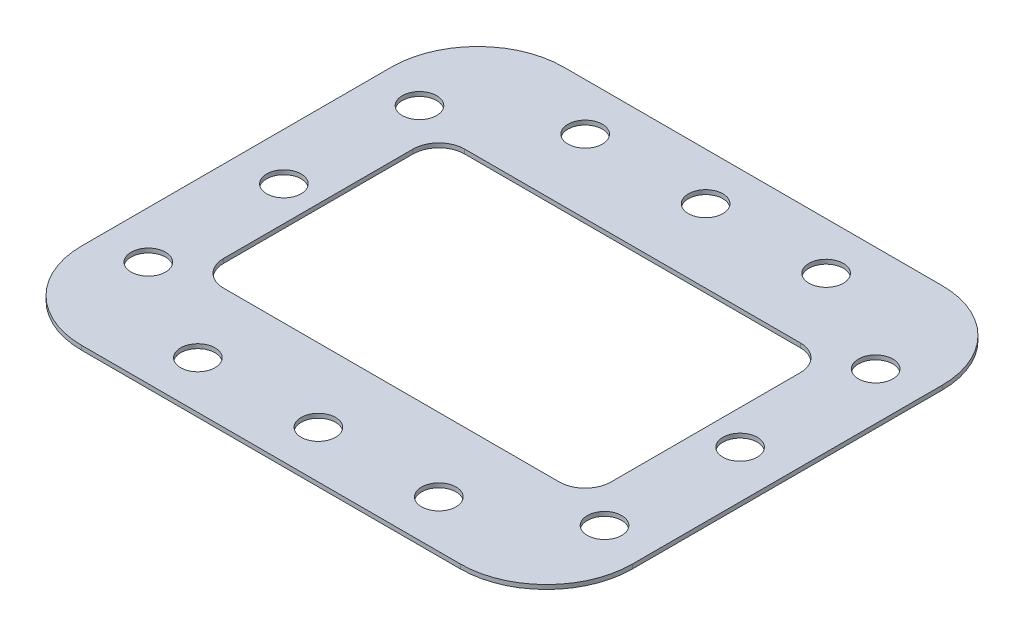
ISO-10303-21;
HEADER;
FILE_DESCRIPTION(('STEP AP214'),'2;1');
FILE_NAME('part.step','',(''),(''),'','','');
FILE_SCHEMA(('AUTOMOTIVE_DESIGN { 1 0 10303 214 1 1 1 1 }'));
ENDSEC;
DATA;
#1=APPLICATION_CONTEXT('core data for automotive mechanical design processes');
#2=APPLICATION_PROTOCOL_DEFINITION('international standard','automotive_design',2000,#1);
#3=PRODUCT_CONTEXT('',#1,'mechanical');
#4=PRODUCT('Part','Part','',(#3));
#5=PRODUCT_RELATED_PRODUCT_CATEGORY('part','',(#4));
#6=PRODUCT_DEFINITION_FORMATION('','',#4);
#7=PRODUCT_DEFINITION_CONTEXT('part definition',#1,'design');
#8=PRODUCT_DEFINITION('design','',#6,#7);
#9=PRODUCT_DEFINITION_SHAPE('','',#8);
#10=(LENGTH_UNIT() NAMED_UNIT(*) SI_UNIT(.MILLI.,.METRE.));
#11=(NAMED_UNIT(*) PLANE_ANGLE_UNIT() SI_UNIT($,.RADIAN.));
#12=(NAMED_UNIT(*) SI_UNIT($,.STERADIAN.) SOLID_ANGLE_UNIT());
#13=UNCERTAINTY_MEASURE_WITH_UNIT(LENGTH_MEASURE(1.E-05),#10,'distance_accuracy_value','');
#14=(GEOMETRIC_REPRESENTATION_CONTEXT(3) GLOBAL_UNCERTAINTY_ASSIGNED_CONTEXT((#13)) GLOBAL_UNIT_ASSIGNED_CONTEXT((#10,
#11,#12)) REPRESENTATION_CONTEXT('',''));
#15=CARTESIAN_POINT('',(0.,0.,0.));
#16=DIRECTION('',(0.,0.,1.));
#17=DIRECTION('',(1.,0.,0.));
#18=AXIS2_PLACEMENT_3D('',#15,#16,#17);
#19=CARTESIAN_POINT('',(-44.,1.,36.));
#20=DIRECTION('',(0.,-1.,0.));
#21=DIRECTION('',(0.,0.,-1.));
#22=AXIS2_PLACEMENT_3D('',#19,#20,#21);
#23=PLANE('',#22);
#24=CARTESIAN_POINT('',(-28.,1.,45.));
#25=DIRECTION('',(0.,1.,0.));
#26=DIRECTION('',(0.,0.,-1.));
#27=AXIS2_PLACEMENT_3D('',#24,#25,#26);
#28=CIRCLE('',#27,4.);
#29=CARTESIAN_POINT('',(-28.,1.,41.));
#30=VERTEX_POINT('',#29);
#31=EDGE_CURVE('E213',#30,#30,#28,.T.);
#32=ORIENTED_EDGE('',*,*,#31,.F.);
#33=EDGE_LOOP('',(#32));
#34=FACE_BOUND('',#33,.T.);
#35=CARTESIAN_POINT('',(0.,1.,45.));
#36=DIRECTION('',(0.,1.,0.));
#37=DIRECTION('',(0.,0.,-1.));
#38=AXIS2_PLACEMENT_3D('',#35,#36,#37);
#39=CIRCLE('',#38,4.);
#40=CARTESIAN_POINT('',(0.,1.,41.));
#41=VERTEX_POINT('',#40);
#42=EDGE_CURVE('E219',#41,#41,#39,.T.);
#43=ORIENTED_EDGE('',*,*,#42,.F.);
#44=EDGE_LOOP('',(#43));
#45=FACE_BOUND('',#44,.T.);
#46=CARTESIAN_POINT('',(28.,1.,45.));
#47=DIRECTION('',(0.,1.,0.));
#48=DIRECTION('',(0.,0.,1.));
#49=AXIS2_PLACEMENT_3D('',#46,#47,#48);
#50=CIRCLE('',#49,4.);
#51=CARTESIAN_POINT('',(28.,1.,49.));
#52=VERTEX_POINT('',#51);
#53=EDGE_CURVE('E225',#52,#52,#50,.T.);
#54=ORIENTED_EDGE('',*,*,#53,.F.);
#55=EDGE_LOOP('',(#54));
#56=FACE_BOUND('',#55,.T.);
#57=CARTESIAN_POINT('',(53.,1.,31.5));
#58=DIRECTION('',(0.,1.,0.));
#59=DIRECTION('',(0.,0.,1.));
#60=AXIS2_PLACEMENT_3D('',#57,#58,#59);
#61=CIRCLE('',#60,4.);
#62=CARTESIAN_POINT('',(53.,1.,35.5));
#63=VERTEX_POINT('',#62);
#64=EDGE_CURVE('E231',#63,#63,#61,.T.);
#65=ORIENTED_EDGE('',*,*,#64,.F.);
#66=EDGE_LOOP('',(#65));
#67=FACE_BOUND('',#66,.T.);
#68=CARTESIAN_POINT('',(53.,1.,0.));
#69=DIRECTION('',(0.,1.,0.));
#70=DIRECTION('',(0.,0.,-1.));
#71=AXIS2_PLACEMENT_3D('',#68,#69,#70);
#72=CIRCLE('',#71,4.);
#73=CARTESIAN_POINT('',(53.,1.,-4.));
#74=VERTEX_POINT('',#73);
#75=EDGE_CURVE('E237',#74,#74,#72,.T.);
#76=ORIENTED_EDGE('',*,*,#75,.F.);
#77=EDGE_LOOP('',(#76));
#78=FACE_BOUND('',#77,.T.);
#79=CARTESIAN_POINT('',(53.,1.,-31.5));
#80=DIRECTION('',(0.,1.,0.));
#81=DIRECTION('',(0.,0.,-1.));
#82=AXIS2_PLACEMENT_3D('',#79,#80,#81);
#83=CIRCLE('',#82,4.);
#84=CARTESIAN_POINT('',(53.,1.,-35.5));
#85=VERTEX_POINT('',#84);
#86=EDGE_CURVE('E243',#85,#85,#83,.T.);
#87=ORIENTED_EDGE('',*,*,#86,.F.);
#88=EDGE_LOOP('',(#87));
#89=FACE_BOUND('',#88,.T.);
#90=CARTESIAN_POINT('',(-53.,1.,31.5));
#91=DIRECTION('',(0.,1.,0.));
#92=DIRECTION('',(0.,0.,-1.));
#93=AXIS2_PLACEMENT_3D('',#90,#91,#92);
#94=CIRCLE('',#93,4.);
#95=CARTESIAN_POINT('',(-53.,1.,27.5));
#96=VERTEX_POINT('',#95);
#97=EDGE_CURVE('E249',#96,#96,#94,.T.);
#98=ORIENTED_EDGE('',*,*,#97,.F.);
#99=EDGE_LOOP('',(#98));
#100=FACE_BOUND('',#99,.T.);
#101=CARTESIAN_POINT('',(-53.,1.,0.));
#102=DIRECTION('',(0.,1.,0.));
#103=DIRECTION('',(0.,0.,1.));
#104=AXIS2_PLACEMENT_3D('',#101,#102,#103);
#105=CIRCLE('',#104,4.);
#106=CARTESIAN_POINT('',(-53.,1.,4.));
#107=VERTEX_POINT('',#106);
#108=EDGE_CURVE('E255',#107,#107,#105,.T.);
#109=ORIENTED_EDGE('',*,*,#108,.F.);
#110=EDGE_LOOP('',(#109));
#111=FACE_BOUND('',#110,.T.);
#112=CARTESIAN_POINT('',(-53.,1.,-31.5));
#113=DIRECTION('',(0.,1.,0.));
#114=DIRECTION('',(0.,0.,1.));
#115=AXIS2_PLACEMENT_3D('',#112,#113,#114);
#116=CIRCLE('',#115,4.);
#117=CARTESIAN_POINT('',(-53.,1.,-27.5));
#118=VERTEX_POINT('',#117);
#119=EDGE_CURVE('E261',#118,#118,#116,.T.);
#120=ORIENTED_EDGE('',*,*,#119,.F.);
#121=EDGE_LOOP('',(#120));
#122=FACE_BOUND('',#121,.T.);
#123=CARTESIAN_POINT('',(28.,1.,-45.));
#124=DIRECTION('',(0.,1.,0.));
#125=DIRECTION('',(0.,0.,-1.));
#126=AXIS2_PLACEMENT_3D('',#123,#124,#125);
#127=CIRCLE('',#126,4.);
#128=CARTESIAN_POINT('',(28.,1.,-49.));
#129=VERTEX_POINT('',#128);
#130=EDGE_CURVE('E267',#129,#129,#127,.T.);
#131=ORIENTED_EDGE('',*,*,#130,.F.);
#132=EDGE_LOOP('',(#131));
#133=FACE_BOUND('',#132,.T.);
#134=CARTESIAN_POINT('',(0.,1.,-45.));
#135=DIRECTION('',(0.,1.,0.));
#136=DIRECTION('',(0.,0.,1.));
#137=AXIS2_PLACEMENT_3D('',#134,#135,#136);
#138=CIRCLE('',#137,4.);
#139=CARTESIAN_POINT('',(0.,1.,-41.));
#140=VERTEX_POINT('',#139);
#141=EDGE_CURVE('E273',#140,#140,#138,.T.);
#142=ORIENTED_EDGE('',*,*,#141,.F.);
#143=EDGE_LOOP('',(#142));
#144=FACE_BOUND('',#143,.T.);
#145=CARTESIAN_POINT('',(-28.,1.,-45.));
#146=DIRECTION('',(0.,1.,0.));
#147=DIRECTION('',(0.,0.,1.));
#148=AXIS2_PLACEMENT_3D('',#145,#146,#147);
#149=CIRCLE('',#148,4.);
#150=CARTESIAN_POINT('',(-28.,1.,-41.));
#151=VERTEX_POINT('',#150);
#152=EDGE_CURVE('E279',#151,#151,#149,.T.);
#153=ORIENTED_EDGE('',*,*,#152,.F.);
#154=EDGE_LOOP('',(#153));
#155=FACE_BOUND('',#154,.T.);
#156=CARTESIAN_POINT('',(-44.,1.,36.));
#157=DIRECTION('',(0.,1.,0.));
#158=DIRECTION('',(0.,0.,-1.));
#159=AXIS2_PLACEMENT_3D('',#156,#157,#158);
#160=CIRCLE('',#159,20.);
#161=CARTESIAN_POINT('',(-64.,1.,35.9999999999999));
#162=VERTEX_POINT('',#161);
#163=CARTESIAN_POINT('',(-43.9999999999998,1.,56.));
#164=VERTEX_POINT('',#163);
#165=EDGE_CURVE('E285',#162,#164,#160,.T.);
#166=ORIENTED_EDGE('',*,*,#165,.T.);
#167=DIRECTION('',(1.,0.,0.));
#168=VECTOR('',#167,1.);
#169=CARTESIAN_POINT('',(-43.9999999999998,1.,56.));
#170=LINE('',#169,#168);
#171=CARTESIAN_POINT('',(43.9999999999999,1.,56.));
#172=VERTEX_POINT('',#171);
#173=EDGE_CURVE('E288',#164,#172,#170,.T.);
#174=ORIENTED_EDGE('',*,*,#173,.T.);
#175=CARTESIAN_POINT('',(44.,1.,36.));
#176=DIRECTION('',(0.,1.,0.));
#177=DIRECTION('',(0.,0.,-1.));
#178=AXIS2_PLACEMENT_3D('',#175,#176,#177);
#179=CIRCLE('',#178,20.);
#180=CARTESIAN_POINT('',(64.,1.,35.9999999999999));
#181=VERTEX_POINT('',#180);
#182=EDGE_CURVE('E291',#172,#181,#179,.T.);
#183=ORIENTED_EDGE('',*,*,#182,.T.);
#184=DIRECTION('',(0.,0.,-1.));
#185=VECTOR('',#184,1.);
#186=CARTESIAN_POINT('',(64.,1.,35.9999999999999));
#187=LINE('',#186,#185);
#188=CARTESIAN_POINT('',(64.,1.,-35.9999999999999));
#189=VERTEX_POINT('',#188);
#190=EDGE_CURVE('E293',#181,#189,#187,.T.);
#191=ORIENTED_EDGE('',*,*,#190,.T.);
#192=CARTESIAN_POINT('',(44.,1.,-36.));
#193=DIRECTION('',(0.,1.,0.));
#194=DIRECTION('',(0.,0.,-1.));
#195=AXIS2_PLACEMENT_3D('',#192,#193,#194);
#196=CIRCLE('',#195,20.);
#197=CARTESIAN_POINT('',(43.9999999999999,1.,-56.));
#198=VERTEX_POINT('',#197);
#199=EDGE_CURVE('E295',#189,#198,#196,.T.);
#200=ORIENTED_EDGE('',*,*,#199,.T.);
#201=DIRECTION('',(-1.,0.,0.));
#202=VECTOR('',#201,1.);
#203=CARTESIAN_POINT('',(-43.9999999999998,1.,-56.));
#204=LINE('',#203,#202);
#205=CARTESIAN_POINT('',(-43.9999999999998,1.,-56.));
#206=VERTEX_POINT('',#205);
#207=EDGE_CURVE('E297',#198,#206,#204,.T.);
#208=ORIENTED_EDGE('',*,*,#207,.T.);
#209=CARTESIAN_POINT('',(-44.,1.,-36.));
#210=DIRECTION('',(0.,1.,0.));
#211=DIRECTION('',(0.,0.,1.));
#212=AXIS2_PLACEMENT_3D('',#209,#210,#211);
#213=CIRCLE('',#212,20.);
#214=CARTESIAN_POINT('',(-64.,1.,-35.9999999999999));
#215=VERTEX_POINT('',#214);
#216=EDGE_CURVE('E299',#206,#215,#213,.T.);
#217=ORIENTED_EDGE('',*,*,#216,.T.);
#218=DIRECTION('',(0.,0.,1.));
#219=VECTOR('',#218,1.);
#220=CARTESIAN_POINT('',(-64.,1.,35.9999999999999));
#221=LINE('',#220,#219);
#222=EDGE_CURVE('E301',#215,#162,#221,.T.);
#223=ORIENTED_EDGE('',*,*,#222,.T.);
#224=EDGE_LOOP('',(#166,#174,#183,#191,#200,#208,#217,#223));
#225=FACE_BOUND('',#224,.T.);
#226=CARTESIAN_POINT('',(-39.,1.,22.));
#227=DIRECTION('',(0.,1.,0.));
#228=DIRECTION('',(0.,0.,-1.));
#229=AXIS2_PLACEMENT_3D('',#226,#227,#228);
#230=CIRCLE('',#229,6.);
#231=CARTESIAN_POINT('',(-45.,1.,22.));
#232=VERTEX_POINT('',#231);
#233=CARTESIAN_POINT('',(-38.9999999999999,1.,28.));
#234=VERTEX_POINT('',#233);
#235=EDGE_CURVE('E148',#232,#234,#230,.T.);
#236=ORIENTED_EDGE('',*,*,#235,.F.);
#237=DIRECTION('',(0.,0.,1.));
#238=VECTOR('',#237,1.);
#239=CARTESIAN_POINT('',(-45.,1.,22.));
#240=LINE('',#239,#238);
#241=CARTESIAN_POINT('',(-45.,1.,-22.));
#242=VERTEX_POINT('',#241);
#243=EDGE_CURVE('E181',#242,#232,#240,.T.);
#244=ORIENTED_EDGE('',*,*,#243,.F.);
#245=CARTESIAN_POINT('',(-39.,1.,-22.));
#246=DIRECTION('',(0.,1.,0.));
#247=DIRECTION('',(0.,0.,1.));
#248=AXIS2_PLACEMENT_3D('',#245,#246,#247);
#249=CIRCLE('',#248,6.);
#250=CARTESIAN_POINT('',(-38.9999999999999,1.,-28.));
#251=VERTEX_POINT('',#250);
#252=EDGE_CURVE('E179',#251,#242,#249,.T.);
#253=ORIENTED_EDGE('',*,*,#252,.F.);
#254=DIRECTION('',(-1.,0.,0.));
#255=VECTOR('',#254,1.);
#256=CARTESIAN_POINT('',(-38.9999999999999,1.,-28.));
#257=LINE('',#256,#255);
#258=CARTESIAN_POINT('',(39.,1.,-28.));
#259=VERTEX_POINT('',#258);
#260=EDGE_CURVE('E177',#259,#251,#257,.T.);
#261=ORIENTED_EDGE('',*,*,#260,.F.);
#262=CARTESIAN_POINT('',(39.,1.,-22.));
#263=DIRECTION('',(0.,1.,0.));
#264=DIRECTION('',(0.,0.,1.));
#265=AXIS2_PLACEMENT_3D('',#262,#263,#264);
#266=CIRCLE('',#265,6.);
#267=CARTESIAN_POINT('',(45.,1.,-22.));
#268=VERTEX_POINT('',#267);
#269=EDGE_CURVE('E175',#268,#259,#266,.T.);
#270=ORIENTED_EDGE('',*,*,#269,.F.);
#271=DIRECTION('',(0.,0.,-1.));
#272=VECTOR('',#271,1.);
#273=CARTESIAN_POINT('',(45.,1.,22.));
#274=LINE('',#273,#272);
#275=CARTESIAN_POINT('',(45.,1.,22.));
#276=VERTEX_POINT('',#275);
#277=EDGE_CURVE('E171',#276,#268,#274,.T.);
#278=ORIENTED_EDGE('',*,*,#277,.F.);
#279=CARTESIAN_POINT('',(39.,1.,22.));
#280=DIRECTION('',(0.,1.,0.));
#281=DIRECTION('',(0.,0.,1.));
#282=AXIS2_PLACEMENT_3D('',#279,#280,#281);
#283=CIRCLE('',#282,6.);
#284=CARTESIAN_POINT('',(39.,1.,28.));
#285=VERTEX_POINT('',#284);
#286=EDGE_CURVE('E169',#285,#276,#283,.T.);
#287=ORIENTED_EDGE('',*,*,#286,.F.);
#288=DIRECTION('',(1.,0.,0.));
#289=VECTOR('',#288,1.);
#290=CARTESIAN_POINT('',(-38.9999999999999,1.,28.));
#291=LINE('',#290,#289);
#292=EDGE_CURVE('E156',#234,#285,#291,.T.);
#293=ORIENTED_EDGE('',*,*,#292,.F.);
#294=EDGE_LOOP('',(#236,#244,#253,#261,#270,#278,#287,#293));
#295=FACE_BOUND('',#294,.T.);
#296=ADVANCED_FACE('F35',(#34,#45,#56,#67,#78,#89,#100,#111,#122,#133,#144,#155,#225,#295),#23,.F.);
#297=CARTESIAN_POINT('',(-44.,0.,36.));
#298=DIRECTION('',(0.,-1.,0.));
#299=DIRECTION('',(0.,0.,-1.));
#300=AXIS2_PLACEMENT_3D('',#297,#298,#299);
#301=PLANE('',#300);
#302=CARTESIAN_POINT('',(0.,0.,45.));
#303=DIRECTION('',(0.,1.,0.));
#304=DIRECTION('',(0.,0.,-1.));
#305=AXIS2_PLACEMENT_3D('',#302,#303,#304);
#306=CIRCLE('',#305,4.);
#307=CARTESIAN_POINT('',(0.,0.,41.));
#308=VERTEX_POINT('',#307);
#309=EDGE_CURVE('E216',#308,#308,#306,.T.);
#310=ORIENTED_EDGE('',*,*,#309,.T.);
#311=EDGE_LOOP('',(#310));
#312=FACE_BOUND('',#311,.T.);
#313=CARTESIAN_POINT('',(53.,0.,31.5));
#314=DIRECTION('',(0.,1.,0.));
#315=DIRECTION('',(0.,0.,1.));
#316=AXIS2_PLACEMENT_3D('',#313,#314,#315);
#317=CIRCLE('',#316,4.);
#318=CARTESIAN_POINT('',(53.,0.,35.5));
#319=VERTEX_POINT('',#318);
#320=EDGE_CURVE('E228',#319,#319,#317,.T.);
#321=ORIENTED_EDGE('',*,*,#320,.T.);
#322=EDGE_LOOP('',(#321));
#323=FACE_BOUND('',#322,.T.);
#324=CARTESIAN_POINT('',(53.,0.,-31.5));
#325=DIRECTION('',(0.,1.,0.));
#326=DIRECTION('',(0.,0.,-1.));
#327=AXIS2_PLACEMENT_3D('',#324,#325,#326);
#328=CIRCLE('',#327,4.);
#329=CARTESIAN_POINT('',(53.,0.,-35.5));
#330=VERTEX_POINT('',#329);
#331=EDGE_CURVE('E240',#330,#330,#328,.T.);
#332=ORIENTED_EDGE('',*,*,#331,.T.);
#333=EDGE_LOOP('',(#332));
#334=FACE_BOUND('',#333,.T.);
#335=CARTESIAN_POINT('',(-53.,0.,0.));
#336=DIRECTION('',(0.,1.,0.));
#337=DIRECTION('',(0.,0.,1.));
#338=AXIS2_PLACEMENT_3D('',#335,#336,#337);
#339=CIRCLE('',#338,4.);
#340=CARTESIAN_POINT('',(-53.,0.,4.));
#341=VERTEX_POINT('',#340);
#342=EDGE_CURVE('E252',#341,#341,#339,.T.);
#343=ORIENTED_EDGE('',*,*,#342,.T.);
#344=EDGE_LOOP('',(#343));
#345=FACE_BOUND('',#344,.T.);
#346=CARTESIAN_POINT('',(28.,0.,-45.));
#347=DIRECTION('',(0.,1.,0.));
#348=DIRECTION('',(0.,0.,-1.));
#349=AXIS2_PLACEMENT_3D('',#346,#347,#348);
#350=CIRCLE('',#349,4.);
#351=CARTESIAN_POINT('',(28.,0.,-49.));
#352=VERTEX_POINT('',#351);
#353=EDGE_CURVE('E264',#352,#352,#350,.T.);
#354=ORIENTED_EDGE('',*,*,#353,.T.);
#355=EDGE_LOOP('',(#354));
#356=FACE_BOUND('',#355,.T.);
#357=CARTESIAN_POINT('',(-28.,0.,-45.));
#358=DIRECTION('',(0.,1.,0.));
#359=DIRECTION('',(0.,0.,1.));
#360=AXIS2_PLACEMENT_3D('',#357,#358,#359);
#361=CIRCLE('',#360,4.);
#362=CARTESIAN_POINT('',(-28.,0.,-41.));
#363=VERTEX_POINT('',#362);
#364=EDGE_CURVE('E276',#363,#363,#361,.T.);
#365=ORIENTED_EDGE('',*,*,#364,.T.);
#366=EDGE_LOOP('',(#365));
#367=FACE_BOUND('',#366,.T.);
#368=CARTESIAN_POINT('',(-44.,0.,36.));
#369=DIRECTION('',(0.,1.,0.));
#370=DIRECTION('',(0.,0.,-1.));
#371=AXIS2_PLACEMENT_3D('',#368,#369,#370);
#372=CIRCLE('',#371,20.);
#373=CARTESIAN_POINT('',(-64.,0.,35.9999999999999));
#374=VERTEX_POINT('',#373);
#375=CARTESIAN_POINT('',(-43.9999999999998,0.,56.));
#376=VERTEX_POINT('',#375);
#377=EDGE_CURVE('E282',#374,#376,#372,.T.);
#378=ORIENTED_EDGE('',*,*,#377,.F.);
#379=DIRECTION('',(0.,0.,1.));
#380=VECTOR('',#379,1.);
#381=CARTESIAN_POINT('',(-64.,0.,35.9999999999999));
#382=LINE('',#381,#380);
#383=CARTESIAN_POINT('',(-64.,0.,-35.9999999999999));
#384=VERTEX_POINT('',#383);
#385=EDGE_CURVE('E289',#384,#374,#382,.T.);
#386=ORIENTED_EDGE('',*,*,#385,.F.);
#387=CARTESIAN_POINT('',(-44.,0.,-36.));
#388=DIRECTION('',(0.,1.,0.));
#389=DIRECTION('',(0.,0.,1.));
#390=AXIS2_PLACEMENT_3D('',#387,#388,#389);
#391=CIRCLE('',#390,20.);
#392=CARTESIAN_POINT('',(-43.9999999999998,0.,-56.));
#393=VERTEX_POINT('',#392);
#394=EDGE_CURVE('E316',#393,#384,#391,.T.);
#395=ORIENTED_EDGE('',*,*,#394,.F.);
#396=DIRECTION('',(-1.,0.,0.));
#397=VECTOR('',#396,1.);
#398=CARTESIAN_POINT('',(-43.9999999999998,0.,-56.));
#399=LINE('',#398,#397);
#400=CARTESIAN_POINT('',(43.9999999999999,0.,-56.));
#401=VERTEX_POINT('',#400);
#402=EDGE_CURVE('E314',#401,#393,#399,.T.);
#403=ORIENTED_EDGE('',*,*,#402,.F.);
#404=CARTESIAN_POINT('',(44.,0.,-36.));
#405=DIRECTION('',(0.,1.,0.));
#406=DIRECTION('',(0.,0.,-1.));
#407=AXIS2_PLACEMENT_3D('',#404,#405,#406);
#408=CIRCLE('',#407,20.);
#409=CARTESIAN_POINT('',(64.,0.,-35.9999999999999));
#410=VERTEX_POINT('',#409);
#411=EDGE_CURVE('E312',#410,#401,#408,.T.);
#412=ORIENTED_EDGE('',*,*,#411,.F.);
#413=DIRECTION('',(0.,0.,-1.));
#414=VECTOR('',#413,1.);
#415=CARTESIAN_POINT('',(64.,0.,35.9999999999999));
#416=LINE('',#415,#414);
#417=CARTESIAN_POINT('',(64.,0.,35.9999999999999));
#418=VERTEX_POINT('',#417);
#419=EDGE_CURVE('E310',#418,#410,#416,.T.);
#420=ORIENTED_EDGE('',*,*,#419,.F.);
#421=CARTESIAN_POINT('',(44.,0.,36.));
#422=DIRECTION('',(0.,1.,0.));
#423=DIRECTION('',(0.,0.,-1.));
#424=AXIS2_PLACEMENT_3D('',#421,#422,#423);
#425=CIRCLE('',#424,20.);
#426=CARTESIAN_POINT('',(43.9999999999999,0.,56.));
#427=VERTEX_POINT('',#426);
#428=EDGE_CURVE('E308',#427,#418,#425,.T.);
#429=ORIENTED_EDGE('',*,*,#428,.F.);
#430=DIRECTION('',(1.,0.,0.));
#431=VECTOR('',#430,1.);
#432=CARTESIAN_POINT('',(-43.9999999999998,0.,56.));
#433=LINE('',#432,#431);
#434=EDGE_CURVE('E306',#376,#427,#433,.T.);
#435=ORIENTED_EDGE('',*,*,#434,.F.);
#436=EDGE_LOOP('',(#378,#386,#395,#403,#412,#420,#429,#435));
#437=FACE_BOUND('',#436,.T.);
#438=CARTESIAN_POINT('',(0.,0.,-45.));
#439=DIRECTION('',(0.,1.,0.));
#440=DIRECTION('',(0.,0.,1.));
#441=AXIS2_PLACEMENT_3D('',#438,#439,#440);
#442=CIRCLE('',#441,4.);
#443=CARTESIAN_POINT('',(0.,0.,-41.));
#444=VERTEX_POINT('',#443);
#445=EDGE_CURVE('E270',#444,#444,#442,.T.);
#446=ORIENTED_EDGE('',*,*,#445,.T.);
#447=EDGE_LOOP('',(#446));
#448=FACE_BOUND('',#447,.T.);
#449=CARTESIAN_POINT('',(-53.,0.,-31.5));
#450=DIRECTION('',(0.,1.,0.));
#451=DIRECTION('',(0.,0.,1.));
#452=AXIS2_PLACEMENT_3D('',#449,#450,#451);
#453=CIRCLE('',#452,4.);
#454=CARTESIAN_POINT('',(-53.,0.,-27.5));
#455=VERTEX_POINT('',#454);
#456=EDGE_CURVE('E258',#455,#455,#453,.T.);
#457=ORIENTED_EDGE('',*,*,#456,.T.);
#458=EDGE_LOOP('',(#457));
#459=FACE_BOUND('',#458,.T.);
#460=CARTESIAN_POINT('',(-53.,0.,31.5));
#461=DIRECTION('',(0.,1.,0.));
#462=DIRECTION('',(0.,0.,-1.));
#463=AXIS2_PLACEMENT_3D('',#460,#461,#462);
#464=CIRCLE('',#463,4.);
#465=CARTESIAN_POINT('',(-53.,0.,27.5));
#466=VERTEX_POINT('',#465);
#467=EDGE_CURVE('E246',#466,#466,#464,.T.);
#468=ORIENTED_EDGE('',*,*,#467,.T.);
#469=EDGE_LOOP('',(#468));
#470=FACE_BOUND('',#469,.T.);
#471=CARTESIAN_POINT('',(53.,0.,0.));
#472=DIRECTION('',(0.,1.,0.));
#473=DIRECTION('',(0.,0.,-1.));
#474=AXIS2_PLACEMENT_3D('',#471,#472,#473);
#475=CIRCLE('',#474,4.);
#476=CARTESIAN_POINT('',(53.,0.,-4.));
#477=VERTEX_POINT('',#476);
#478=EDGE_CURVE('E234',#477,#477,#475,.T.);
#479=ORIENTED_EDGE('',*,*,#478,.T.);
#480=EDGE_LOOP('',(#479));
#481=FACE_BOUND('',#480,.T.);
#482=CARTESIAN_POINT('',(28.,0.,45.));
#483=DIRECTION('',(0.,1.,0.));
#484=DIRECTION('',(0.,0.,1.));
#485=AXIS2_PLACEMENT_3D('',#482,#483,#484);
#486=CIRCLE('',#485,4.);
#487=CARTESIAN_POINT('',(28.,0.,49.));
#488=VERTEX_POINT('',#487);
#489=EDGE_CURVE('E222',#488,#488,#486,.T.);
#490=ORIENTED_EDGE('',*,*,#489,.T.);
#491=EDGE_LOOP('',(#490));
#492=FACE_BOUND('',#491,.T.);
#493=CARTESIAN_POINT('',(-28.,0.,45.));
#494=DIRECTION('',(0.,1.,0.));
#495=DIRECTION('',(0.,0.,-1.));
#496=AXIS2_PLACEMENT_3D('',#493,#494,#495);
#497=CIRCLE('',#496,4.);
#498=CARTESIAN_POINT('',(-28.,0.,41.));
#499=VERTEX_POINT('',#498);
#500=EDGE_CURVE('E164',#499,#499,#497,.T.);
#501=ORIENTED_EDGE('',*,*,#500,.T.);
#502=EDGE_LOOP('',(#501));
#503=FACE_BOUND('',#502,.T.);
#504=DIRECTION('',(0.,0.,1.));
#505=VECTOR('',#504,1.);
#506=CARTESIAN_POINT('',(-45.,0.,22.));
#507=LINE('',#506,#505);
#508=CARTESIAN_POINT('',(-45.,0.,-22.));
#509=VERTEX_POINT('',#508);
#510=CARTESIAN_POINT('',(-45.,0.,22.));
#511=VERTEX_POINT('',#510);
#512=EDGE_CURVE('E157',#509,#511,#507,.T.);
#513=ORIENTED_EDGE('',*,*,#512,.T.);
#514=CARTESIAN_POINT('',(-39.,0.,22.));
#515=DIRECTION('',(0.,1.,0.));
#516=DIRECTION('',(0.,0.,-1.));
#517=AXIS2_PLACEMENT_3D('',#514,#515,#516);
#518=CIRCLE('',#517,6.);
#519=CARTESIAN_POINT('',(-38.9999999999999,0.,28.));
#520=VERTEX_POINT('',#519);
#521=EDGE_CURVE('E58',#511,#520,#518,.T.);
#522=ORIENTED_EDGE('',*,*,#521,.T.);
#523=DIRECTION('',(1.,0.,0.));
#524=VECTOR('',#523,1.);
#525=CARTESIAN_POINT('',(-38.9999999999999,0.,28.));
#526=LINE('',#525,#524);
#527=CARTESIAN_POINT('',(39.,0.,28.));
#528=VERTEX_POINT('',#527);
#529=EDGE_CURVE('E163',#520,#528,#526,.T.);
#530=ORIENTED_EDGE('',*,*,#529,.T.);
#531=CARTESIAN_POINT('',(39.,0.,22.));
#532=DIRECTION('',(0.,1.,0.));
#533=DIRECTION('',(0.,0.,1.));
#534=AXIS2_PLACEMENT_3D('',#531,#532,#533);
#535=CIRCLE('',#534,6.);
#536=CARTESIAN_POINT('',(45.,0.,22.));
#537=VERTEX_POINT('',#536);
#538=EDGE_CURVE('E185',#528,#537,#535,.T.);
#539=ORIENTED_EDGE('',*,*,#538,.T.);
#540=DIRECTION('',(0.,0.,-1.));
#541=VECTOR('',#540,1.);
#542=CARTESIAN_POINT('',(45.,0.,22.));
#543=LINE('',#542,#541);
#544=CARTESIAN_POINT('',(45.,0.,-22.));
#545=VERTEX_POINT('',#544);
#546=EDGE_CURVE('E188',#537,#545,#543,.T.);
#547=ORIENTED_EDGE('',*,*,#546,.T.);
#548=CARTESIAN_POINT('',(39.,0.,-22.));
#549=DIRECTION('',(0.,1.,0.));
#550=DIRECTION('',(0.,0.,1.));
#551=AXIS2_PLACEMENT_3D('',#548,#549,#550);
#552=CIRCLE('',#551,6.);
#553=CARTESIAN_POINT('',(39.,0.,-28.));
#554=VERTEX_POINT('',#553);
#555=EDGE_CURVE('E191',#545,#554,#552,.T.);
#556=ORIENTED_EDGE('',*,*,#555,.T.);
#557=DIRECTION('',(-1.,0.,0.));
#558=VECTOR('',#557,1.);
#559=CARTESIAN_POINT('',(-38.9999999999999,0.,-28.));
#560=LINE('',#559,#558);
#561=CARTESIAN_POINT('',(-38.9999999999999,0.,-28.));
#562=VERTEX_POINT('',#561);
#563=EDGE_CURVE('E194',#554,#562,#560,.T.);
#564=ORIENTED_EDGE('',*,*,#563,.T.);
#565=CARTESIAN_POINT('',(-39.,0.,-22.));
#566=DIRECTION('',(0.,1.,0.));
#567=DIRECTION('',(0.,0.,1.));
#568=AXIS2_PLACEMENT_3D('',#565,#566,#567);
#569=CIRCLE('',#568,6.);
#570=EDGE_CURVE('E197',#562,#509,#569,.T.);
#571=ORIENTED_EDGE('',*,*,#570,.T.);
#572=EDGE_LOOP('',(#513,#522,#530,#539,#547,#556,#564,#571));
#573=FACE_BOUND('',#572,.T.);
#574=ADVANCED_FACE('F346',(#312,#323,#334,#345,#356,#367,#437,#448,#459,#470,#481,#492,#503,
#573),#301,.T.);
#575=CARTESIAN_POINT('',(-44.,1.,36.));
#576=DIRECTION('',(0.,-1.,0.));
#577=DIRECTION('',(0.,0.,-1.));
#578=AXIS2_PLACEMENT_3D('',#575,#576,#577);
#579=CYLINDRICAL_SURFACE('',#578,20.);
#580=ORIENTED_EDGE('',*,*,#377,.T.);
#581=DIRECTION('',(0.,-1.,0.));
#582=VECTOR('',#581,1.);
#583=CARTESIAN_POINT('',(-43.9999999999998,1.,56.));
#584=LINE('',#583,#582);
#585=EDGE_CURVE('E11',#164,#376,#584,.T.);
#586=ORIENTED_EDGE('',*,*,#585,.F.);
#587=ORIENTED_EDGE('',*,*,#165,.F.);
#588=DIRECTION('',(0.,-1.,0.));
#589=VECTOR('',#588,1.);
#590=CARTESIAN_POINT('',(-64.,1.,35.9999999999999));
#591=LINE('',#590,#589);
#592=EDGE_CURVE('E303',#162,#374,#591,.T.);
#593=ORIENTED_EDGE('',*,*,#592,.T.);
#594=EDGE_LOOP('',(#580,#586,#587,#593));
#595=FACE_BOUND('',#594,.T.);
#596=ADVANCED_FACE('F37',(#595),#579,.T.);
#597=CARTESIAN_POINT('',(-43.9999999999998,1.,56.));
#598=DIRECTION('',(0.,0.,-1.));
#599=DIRECTION('',(-1.,0.,0.));
#600=AXIS2_PLACEMENT_3D('',#597,#598,#599);
#601=PLANE('',#600);
#602=ORIENTED_EDGE('',*,*,#434,.T.);
#603=DIRECTION('',(0.,-1.,0.));
#604=VECTOR('',#603,1.);
#605=CARTESIAN_POINT('',(43.9999999999999,1.,56.));
#606=LINE('',#605,#604);
#607=EDGE_CURVE('E43',#172,#427,#606,.T.);
#608=ORIENTED_EDGE('',*,*,#607,.F.);
#609=ORIENTED_EDGE('',*,*,#173,.F.);
#610=ORIENTED_EDGE('',*,*,#585,.T.);
#611=EDGE_LOOP('',(#602,#608,#609,#610));
#612=FACE_BOUND('',#611,.T.);
#613=ADVANCED_FACE('F363',(#612),#601,.F.);
#614=CARTESIAN_POINT('',(44.,1.,36.));
#615=DIRECTION('',(0.,-1.,0.));
#616=DIRECTION('',(0.,0.,-1.));
#617=AXIS2_PLACEMENT_3D('',#614,#615,#616);
#618=CYLINDRICAL_SURFACE('',#617,20.);
#619=ORIENTED_EDGE('',*,*,#428,.T.);
#620=DIRECTION('',(0.,-1.,0.));
#621=VECTOR('',#620,1.);
#622=CARTESIAN_POINT('',(64.,1.,35.9999999999999));
#623=LINE('',#622,#621);
#624=EDGE_CURVE('E333',#181,#418,#623,.T.);
#625=ORIENTED_EDGE('',*,*,#624,.F.);
#626=ORIENTED_EDGE('',*,*,#182,.F.);
#627=ORIENTED_EDGE('',*,*,#607,.T.);
#628=EDGE_LOOP('',(#619,#625,#626,#627));
#629=FACE_BOUND('',#628,.T.);
#630=ADVANCED_FACE('F340',(#629),#618,.T.);
#631=CARTESIAN_POINT('',(64.,1.,35.9999999999999));
#632=DIRECTION('',(-1.,0.,0.));
#633=DIRECTION('',(0.,0.,1.));
#634=AXIS2_PLACEMENT_3D('',#631,#632,#633);
#635=PLANE('',#634);
#636=ORIENTED_EDGE('',*,*,#419,.T.);
#637=DIRECTION('',(0.,-1.,0.));
#638=VECTOR('',#637,1.);
#639=CARTESIAN_POINT('',(64.,1.,-35.9999999999999));
#640=LINE('',#639,#638);
#641=EDGE_CURVE('E330',#189,#410,#640,.T.);
#642=ORIENTED_EDGE('',*,*,#641,.F.);
#643=ORIENTED_EDGE('',*,*,#190,.F.);
#644=ORIENTED_EDGE('',*,*,#624,.T.);
#645=EDGE_LOOP('',(#636,#642,#643,#644));
#646=FACE_BOUND('',#645,.T.);
#647=ADVANCED_FACE('F352',(#646),#635,.F.);
#648=CARTESIAN_POINT('',(44.,1.,-36.));
#649=DIRECTION('',(0.,-1.,0.));
#650=DIRECTION('',(0.,0.,-1.));
#651=AXIS2_PLACEMENT_3D('',#648,#649,#650);
#652=CYLINDRICAL_SURFACE('',#651,20.);
#653=ORIENTED_EDGE('',*,*,#411,.T.);
#654=DIRECTION('',(0.,-1.,0.));
#655=VECTOR('',#654,1.);
#656=CARTESIAN_POINT('',(43.9999999999999,1.,-56.));
#657=LINE('',#656,#655);
#658=EDGE_CURVE('E327',#198,#401,#657,.T.);
#659=ORIENTED_EDGE('',*,*,#658,.F.);
#660=ORIENTED_EDGE('',*,*,#199,.F.);
#661=ORIENTED_EDGE('',*,*,#641,.T.);
#662=EDGE_LOOP('',(#653,#659,#660,#661));
#663=FACE_BOUND('',#662,.T.);
#664=ADVANCED_FACE('F356',(#663),#652,.T.);
#665=CARTESIAN_POINT('',(-43.9999999999998,1.,-56.));
#666=DIRECTION('',(0.,0.,1.));
#667=DIRECTION('',(1.,0.,0.));
#668=AXIS2_PLACEMENT_3D('',#665,#666,#667);
#669=PLANE('',#668);
#670=ORIENTED_EDGE('',*,*,#402,.T.);
#671=DIRECTION('',(0.,-1.,0.));
#672=VECTOR('',#671,1.);
#673=CARTESIAN_POINT('',(-43.9999999999998,1.,-56.));
#674=LINE('',#673,#672);
#675=EDGE_CURVE('E324',#206,#393,#674,.T.);
#676=ORIENTED_EDGE('',*,*,#675,.F.);
#677=ORIENTED_EDGE('',*,*,#207,.F.);
#678=ORIENTED_EDGE('',*,*,#658,.T.);
#679=EDGE_LOOP('',(#670,#676,#677,#678));
#680=FACE_BOUND('',#679,.T.);
#681=ADVANCED_FACE('F376',(#680),#669,.F.);
#682=CARTESIAN_POINT('',(-44.,1.,-36.));
#683=DIRECTION('',(0.,-1.,0.));
#684=DIRECTION('',(0.,0.,-1.));
#685=AXIS2_PLACEMENT_3D('',#682,#683,#684);
#686=CYLINDRICAL_SURFACE('',#685,20.);
#687=ORIENTED_EDGE('',*,*,#394,.T.);
#688=DIRECTION('',(0.,-1.,0.));
#689=VECTOR('',#688,1.);
#690=CARTESIAN_POINT('',(-64.,1.,-35.9999999999999));
#691=LINE('',#690,#689);
#692=EDGE_CURVE('E321',#215,#384,#691,.T.);
#693=ORIENTED_EDGE('',*,*,#692,.F.);
#694=ORIENTED_EDGE('',*,*,#216,.F.);
#695=ORIENTED_EDGE('',*,*,#675,.T.);
#696=EDGE_LOOP('',(#687,#693,#694,#695));
#697=FACE_BOUND('',#696,.T.);
#698=ADVANCED_FACE('F374',(#697),#686,.T.);
#699=CARTESIAN_POINT('',(-64.,1.,35.9999999999999));
#700=DIRECTION('',(1.,0.,0.));
#701=DIRECTION('',(0.,0.,-1.));
#702=AXIS2_PLACEMENT_3D('',#699,#700,#701);
#703=PLANE('',#702);
#704=ORIENTED_EDGE('',*,*,#385,.T.);
#705=ORIENTED_EDGE('',*,*,#592,.F.);
#706=ORIENTED_EDGE('',*,*,#222,.F.);
#707=ORIENTED_EDGE('',*,*,#692,.T.);
#708=EDGE_LOOP('',(#704,#705,#706,#707));
#709=FACE_BOUND('',#708,.T.);
#710=ADVANCED_FACE('F369',(#709),#703,.F.);
#711=CARTESIAN_POINT('',(-28.,1.,-45.));
#712=DIRECTION('',(0.,-1.,0.));
#713=DIRECTION('',(0.,0.,-1.));
#714=AXIS2_PLACEMENT_3D('',#711,#712,#713);
#715=CYLINDRICAL_SURFACE('',#714,4.);
#716=ORIENTED_EDGE('',*,*,#152,.T.);
#717=EDGE_LOOP('',(#716));
#718=FACE_BOUND('',#717,.T.);
#719=ORIENTED_EDGE('',*,*,#364,.F.);
#720=EDGE_LOOP('',(#719));
#721=FACE_BOUND('',#720,.T.);
#722=ADVANCED_FACE('F396',(#718,#721),#715,.F.);
#723=CARTESIAN_POINT('',(0.,1.,-45.));
#724=DIRECTION('',(0.,-1.,0.));
#725=DIRECTION('',(0.,0.,-1.));
#726=AXIS2_PLACEMENT_3D('',#723,#724,#725);
#727=CYLINDRICAL_SURFACE('',#726,4.);
#728=ORIENTED_EDGE('',*,*,#141,.T.);
#729=EDGE_LOOP('',(#728));
#730=FACE_BOUND('',#729,.T.);
#731=ORIENTED_EDGE('',*,*,#445,.F.);
#732=EDGE_LOOP('',(#731));
#733=FACE_BOUND('',#732,.T.);
#734=ADVANCED_FACE('F403',(#730,#733),#727,.F.);
#735=CARTESIAN_POINT('',(28.,1.,-45.));
#736=DIRECTION('',(0.,-1.,0.));
#737=DIRECTION('',(0.,0.,-1.));
#738=AXIS2_PLACEMENT_3D('',#735,#736,#737);
#739=CYLINDRICAL_SURFACE('',#738,4.);
#740=ORIENTED_EDGE('',*,*,#130,.T.);
#741=EDGE_LOOP('',(#740));
#742=FACE_BOUND('',#741,.T.);
#743=ORIENTED_EDGE('',*,*,#353,.F.);
#744=EDGE_LOOP('',(#743));
#745=FACE_BOUND('',#744,.T.);
#746=ADVANCED_FACE('F408',(#742,#745),#739,.F.);
#747=CARTESIAN_POINT('',(-53.,1.,-31.5));
#748=DIRECTION('',(0.,-1.,0.));
#749=DIRECTION('',(0.,0.,-1.));
#750=AXIS2_PLACEMENT_3D('',#747,#748,#749);
#751=CYLINDRICAL_SURFACE('',#750,4.);
#752=ORIENTED_EDGE('',*,*,#119,.T.);
#753=EDGE_LOOP('',(#752));
#754=FACE_BOUND('',#753,.T.);
#755=ORIENTED_EDGE('',*,*,#456,.F.);
#756=EDGE_LOOP('',(#755));
#757=FACE_BOUND('',#756,.T.);
#758=ADVANCED_FACE('F418',(#754,#757),#751,.F.);
#759=CARTESIAN_POINT('',(-53.,1.,0.));
#760=DIRECTION('',(0.,-1.,0.));
#761=DIRECTION('',(0.,0.,-1.));
#762=AXIS2_PLACEMENT_3D('',#759,#760,#761);
#763=CYLINDRICAL_SURFACE('',#762,4.);
#764=ORIENTED_EDGE('',*,*,#108,.T.);
#765=EDGE_LOOP('',(#764));
#766=FACE_BOUND('',#765,.T.);
#767=ORIENTED_EDGE('',*,*,#342,.F.);
#768=EDGE_LOOP('',(#767));
#769=FACE_BOUND('',#768,.T.);
#770=ADVANCED_FACE('F425',(#766,#769),#763,.F.);
#771=CARTESIAN_POINT('',(-53.,1.,31.5));
#772=DIRECTION('',(0.,-1.,0.));
#773=DIRECTION('',(0.,0.,-1.));
#774=AXIS2_PLACEMENT_3D('',#771,#772,#773);
#775=CYLINDRICAL_SURFACE('',#774,4.);
#776=ORIENTED_EDGE('',*,*,#97,.T.);
#777=EDGE_LOOP('',(#776));
#778=FACE_BOUND('',#777,.T.);
#779=ORIENTED_EDGE('',*,*,#467,.F.);
#780=EDGE_LOOP('',(#779));
#781=FACE_BOUND('',#780,.T.);
#782=ADVANCED_FACE('F429',(#778,#781),#775,.F.);
#783=CARTESIAN_POINT('',(53.,1.,-31.5));
#784=DIRECTION('',(0.,-1.,0.));
#785=DIRECTION('',(0.,0.,-1.));
#786=AXIS2_PLACEMENT_3D('',#783,#784,#785);
#787=CYLINDRICAL_SURFACE('',#786,4.);
#788=ORIENTED_EDGE('',*,*,#86,.T.);
#789=EDGE_LOOP('',(#788));
#790=FACE_BOUND('',#789,.T.);
#791=ORIENTED_EDGE('',*,*,#331,.F.);
#792=EDGE_LOOP('',(#791));
#793=FACE_BOUND('',#792,.T.);
#794=ADVANCED_FACE('F433',(#790,#793),#787,.F.);
#795=CARTESIAN_POINT('',(53.,1.,0.));
#796=DIRECTION('',(0.,-1.,0.));
#797=DIRECTION('',(0.,0.,-1.));
#798=AXIS2_PLACEMENT_3D('',#795,#796,#797);
#799=CYLINDRICAL_SURFACE('',#798,4.);
#800=ORIENTED_EDGE('',*,*,#75,.T.);
#801=EDGE_LOOP('',(#800));
#802=FACE_BOUND('',#801,.T.);
#803=ORIENTED_EDGE('',*,*,#478,.F.);
#804=EDGE_LOOP('',(#803));
#805=FACE_BOUND('',#804,.T.);
#806=ADVANCED_FACE('F437',(#802,#805),#799,.F.);
#807=CARTESIAN_POINT('',(53.,1.,31.5));
#808=DIRECTION('',(0.,-1.,0.));
#809=DIRECTION('',(0.,0.,-1.));
#810=AXIS2_PLACEMENT_3D('',#807,#808,#809);
#811=CYLINDRICAL_SURFACE('',#810,4.);
#812=ORIENTED_EDGE('',*,*,#64,.T.);
#813=EDGE_LOOP('',(#812));
#814=FACE_BOUND('',#813,.T.);
#815=ORIENTED_EDGE('',*,*,#320,.F.);
#816=EDGE_LOOP('',(#815));
#817=FACE_BOUND('',#816,.T.);
#818=ADVANCED_FACE('F441',(#814,#817),#811,.F.);
#819=CARTESIAN_POINT('',(28.,1.,45.));
#820=DIRECTION('',(0.,-1.,0.));
#821=DIRECTION('',(0.,0.,-1.));
#822=AXIS2_PLACEMENT_3D('',#819,#820,#821);
#823=CYLINDRICAL_SURFACE('',#822,4.);
#824=ORIENTED_EDGE('',*,*,#53,.T.);
#825=EDGE_LOOP('',(#824));
#826=FACE_BOUND('',#825,.T.);
#827=ORIENTED_EDGE('',*,*,#489,.F.);
#828=EDGE_LOOP('',(#827));
#829=FACE_BOUND('',#828,.T.);
#830=ADVANCED_FACE('F445',(#826,#829),#823,.F.);
#831=CARTESIAN_POINT('',(0.,1.,45.));
#832=DIRECTION('',(0.,-1.,0.));
#833=DIRECTION('',(0.,0.,-1.));
#834=AXIS2_PLACEMENT_3D('',#831,#832,#833);
#835=CYLINDRICAL_SURFACE('',#834,4.);
#836=ORIENTED_EDGE('',*,*,#42,.T.);
#837=EDGE_LOOP('',(#836));
#838=FACE_BOUND('',#837,.T.);
#839=ORIENTED_EDGE('',*,*,#309,.F.);
#840=EDGE_LOOP('',(#839));
#841=FACE_BOUND('',#840,.T.);
#842=ADVANCED_FACE('F449',(#838,#841),#835,.F.);
#843=CARTESIAN_POINT('',(-28.,1.,45.));
#844=DIRECTION('',(0.,-1.,0.));
#845=DIRECTION('',(0.,0.,-1.));
#846=AXIS2_PLACEMENT_3D('',#843,#844,#845);
#847=CYLINDRICAL_SURFACE('',#846,4.);
#848=ORIENTED_EDGE('',*,*,#31,.T.);
#849=EDGE_LOOP('',(#848));
#850=FACE_BOUND('',#849,.T.);
#851=ORIENTED_EDGE('',*,*,#500,.F.);
#852=EDGE_LOOP('',(#851));
#853=FACE_BOUND('',#852,.T.);
#854=ADVANCED_FACE('F453',(#850,#853),#847,.F.);
#855=CARTESIAN_POINT('',(-39.,1.,22.));
#856=DIRECTION('',(0.,-1.,0.));
#857=DIRECTION('',(0.,0.,-1.));
#858=AXIS2_PLACEMENT_3D('',#855,#856,#857);
#859=CYLINDRICAL_SURFACE('',#858,6.);
#860=ORIENTED_EDGE('',*,*,#521,.F.);
#861=DIRECTION('',(0.,-1.,0.));
#862=VECTOR('',#861,1.);
#863=CARTESIAN_POINT('',(-45.,1.,22.));
#864=LINE('',#863,#862);
#865=EDGE_CURVE('E152',#232,#511,#864,.T.);
#866=ORIENTED_EDGE('',*,*,#865,.F.);
#867=ORIENTED_EDGE('',*,*,#235,.T.);
#868=DIRECTION('',(0.,-1.,0.));
#869=VECTOR('',#868,1.);
#870=CARTESIAN_POINT('',(-38.9999999999999,1.,28.));
#871=LINE('',#870,#869);
#872=EDGE_CURVE('E151',#234,#520,#871,.T.);
#873=ORIENTED_EDGE('',*,*,#872,.T.);
#874=EDGE_LOOP('',(#860,#866,#867,#873));
#875=FACE_BOUND('',#874,.T.);
#876=ADVANCED_FACE('F150',(#875),#859,.F.);
#877=CARTESIAN_POINT('',(-38.9999999999999,1.,28.));
#878=DIRECTION('',(0.,0.,-1.));
#879=DIRECTION('',(-1.,0.,0.));
#880=AXIS2_PLACEMENT_3D('',#877,#878,#879);
#881=PLANE('',#880);
#882=ORIENTED_EDGE('',*,*,#529,.F.);
#883=ORIENTED_EDGE('',*,*,#872,.F.);
#884=ORIENTED_EDGE('',*,*,#292,.T.);
#885=DIRECTION('',(0.,-1.,0.));
#886=VECTOR('',#885,1.);
#887=CARTESIAN_POINT('',(39.,1.,28.));
#888=LINE('',#887,#886);
#889=EDGE_CURVE('E165',#285,#528,#888,.T.);
#890=ORIENTED_EDGE('',*,*,#889,.T.);
#891=EDGE_LOOP('',(#882,#883,#884,#890));
#892=FACE_BOUND('',#891,.T.);
#893=ADVANCED_FACE('F160',(#892),#881,.T.);
#894=CARTESIAN_POINT('',(39.,1.,22.));
#895=DIRECTION('',(0.,-1.,0.));
#896=DIRECTION('',(0.,0.,-1.));
#897=AXIS2_PLACEMENT_3D('',#894,#895,#896);
#898=CYLINDRICAL_SURFACE('',#897,6.);
#899=ORIENTED_EDGE('',*,*,#538,.F.);
#900=ORIENTED_EDGE('',*,*,#889,.F.);
#901=ORIENTED_EDGE('',*,*,#286,.T.);
#902=DIRECTION('',(0.,-1.,0.));
#903=VECTOR('',#902,1.);
#904=CARTESIAN_POINT('',(45.,1.,22.));
#905=LINE('',#904,#903);
#906=EDGE_CURVE('E210',#276,#537,#905,.T.);
#907=ORIENTED_EDGE('',*,*,#906,.T.);
#908=EDGE_LOOP('',(#899,#900,#901,#907));
#909=FACE_BOUND('',#908,.T.);
#910=ADVANCED_FACE('F462',(#909),#898,.F.);
#911=CARTESIAN_POINT('',(45.,1.,22.));
#912=DIRECTION('',(-1.,0.,0.));
#913=DIRECTION('',(0.,0.,1.));
#914=AXIS2_PLACEMENT_3D('',#911,#912,#913);
#915=PLANE('',#914);
#916=ORIENTED_EDGE('',*,*,#546,.F.);
#917=ORIENTED_EDGE('',*,*,#906,.F.);
#918=ORIENTED_EDGE('',*,*,#277,.T.);
#919=DIRECTION('',(0.,-1.,0.));
#920=VECTOR('',#919,1.);
#921=CARTESIAN_POINT('',(45.,1.,-22.));
#922=LINE('',#921,#920);
#923=EDGE_CURVE('E208',#268,#545,#922,.T.);
#924=ORIENTED_EDGE('',*,*,#923,.T.);
#925=EDGE_LOOP('',(#916,#917,#918,#924));
#926=FACE_BOUND('',#925,.T.);
#927=ADVANCED_FACE('F465',(#926),#915,.T.);
#928=CARTESIAN_POINT('',(39.,1.,-22.));
#929=DIRECTION('',(0.,-1.,0.));
#930=DIRECTION('',(0.,0.,-1.));
#931=AXIS2_PLACEMENT_3D('',#928,#929,#930);
#932=CYLINDRICAL_SURFACE('',#931,6.);
#933=ORIENTED_EDGE('',*,*,#555,.F.);
#934=ORIENTED_EDGE('',*,*,#923,.F.);
#935=ORIENTED_EDGE('',*,*,#269,.T.);
#936=DIRECTION('',(0.,-1.,0.));
#937=VECTOR('',#936,1.);
#938=CARTESIAN_POINT('',(39.,1.,-28.));
#939=LINE('',#938,#937);
#940=EDGE_CURVE('E206',#259,#554,#939,.T.);
#941=ORIENTED_EDGE('',*,*,#940,.T.);
#942=EDGE_LOOP('',(#933,#934,#935,#941));
#943=FACE_BOUND('',#942,.T.);
#944=ADVANCED_FACE('F469',(#943),#932,.F.);
#945=CARTESIAN_POINT('',(-38.9999999999999,1.,-28.));
#946=DIRECTION('',(0.,0.,1.));
#947=DIRECTION('',(1.,0.,0.));
#948=AXIS2_PLACEMENT_3D('',#945,#946,#947);
#949=PLANE('',#948);
#950=ORIENTED_EDGE('',*,*,#563,.F.);
#951=ORIENTED_EDGE('',*,*,#940,.F.);
#952=ORIENTED_EDGE('',*,*,#260,.T.);
#953=DIRECTION('',(0.,-1.,0.));
#954=VECTOR('',#953,1.);
#955=CARTESIAN_POINT('',(-38.9999999999999,1.,-28.));
#956=LINE('',#955,#954);
#957=EDGE_CURVE('E204',#251,#562,#956,.T.);
#958=ORIENTED_EDGE('',*,*,#957,.T.);
#959=EDGE_LOOP('',(#950,#951,#952,#958));
#960=FACE_BOUND('',#959,.T.);
#961=ADVANCED_FACE('F473',(#960),#949,.T.);
#962=CARTESIAN_POINT('',(-39.,1.,-22.));
#963=DIRECTION('',(0.,-1.,0.));
#964=DIRECTION('',(0.,0.,-1.));
#965=AXIS2_PLACEMENT_3D('',#962,#963,#964);
#966=CYLINDRICAL_SURFACE('',#965,6.);
#967=ORIENTED_EDGE('',*,*,#570,.F.);
#968=ORIENTED_EDGE('',*,*,#957,.F.);
#969=ORIENTED_EDGE('',*,*,#252,.T.);
#970=DIRECTION('',(0.,-1.,0.));
#971=VECTOR('',#970,1.);
#972=CARTESIAN_POINT('',(-45.,1.,-22.));
#973=LINE('',#972,#971);
#974=EDGE_CURVE('E50',#242,#509,#973,.T.);
#975=ORIENTED_EDGE('',*,*,#974,.T.);
#976=EDGE_LOOP('',(#967,#968,#969,#975));
#977=FACE_BOUND('',#976,.T.);
#978=ADVANCED_FACE('F477',(#977),#966,.F.);
#979=CARTESIAN_POINT('',(-45.,1.,22.));
#980=DIRECTION('',(1.,0.,0.));
#981=DIRECTION('',(0.,0.,-1.));
#982=AXIS2_PLACEMENT_3D('',#979,#980,#981);
#983=PLANE('',#982);
#984=ORIENTED_EDGE('',*,*,#512,.F.);
#985=ORIENTED_EDGE('',*,*,#974,.F.);
#986=ORIENTED_EDGE('',*,*,#243,.T.);
#987=ORIENTED_EDGE('',*,*,#865,.T.);
#988=EDGE_LOOP('',(#984,#985,#986,#987));
#989=FACE_BOUND('',#988,.T.);
#990=ADVANCED_FACE('F481',(#989),#983,.T.);
#991=CLOSED_SHELL('',(#296,#574,#596,#613,#630,#647,#664,#681,#698,#710,#722,#734,#746,#758,
#770,#782,#794,#806,#818,#830,#842,#854,#876,#893,#910,#927,#944,#961,#978,#990));
#992=MANIFOLD_SOLID_BREP('B2',#991);
#993=ADVANCED_BREP_SHAPE_REPRESENTATION('',(#18,#992),#14);
#994=SHAPE_DEFINITION_REPRESENTATION(#9,#993);
ENDSEC;
END-ISO-10303-21;
